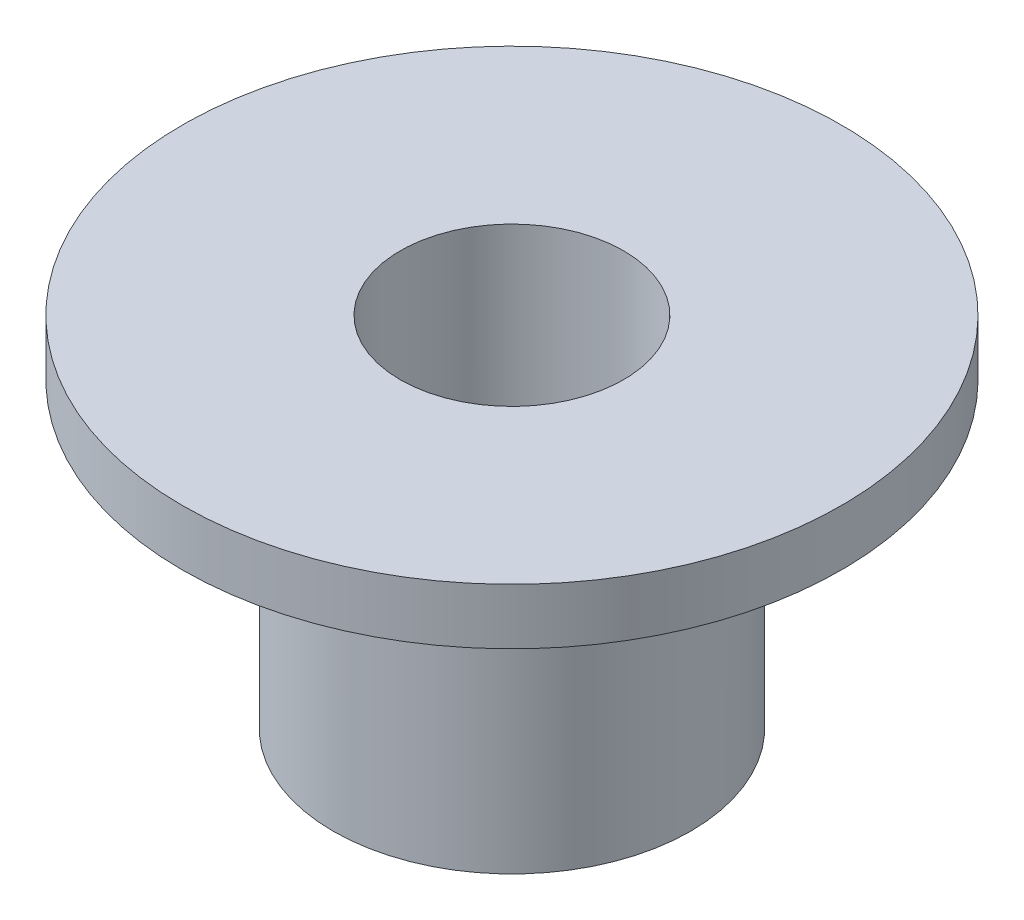
ISO-10303-21;
HEADER;
FILE_DESCRIPTION(('STEP AP214'),'2;1');
FILE_NAME('part.step','',(''),(''),'','','');
FILE_SCHEMA(('AUTOMOTIVE_DESIGN { 1 0 10303 214 1 1 1 1 }'));
ENDSEC;
DATA;
#1=APPLICATION_CONTEXT('core data for automotive mechanical design processes');
#2=APPLICATION_PROTOCOL_DEFINITION('international standard','automotive_design',2000,#1);
#3=PRODUCT_CONTEXT('',#1,'mechanical');
#4=PRODUCT('Part','Part','',(#3));
#5=PRODUCT_RELATED_PRODUCT_CATEGORY('part','',(#4));
#6=PRODUCT_DEFINITION_FORMATION('','',#4);
#7=PRODUCT_DEFINITION_CONTEXT('part definition',#1,'design');
#8=PRODUCT_DEFINITION('design','',#6,#7);
#9=PRODUCT_DEFINITION_SHAPE('','',#8);
#10=(LENGTH_UNIT() NAMED_UNIT(*) SI_UNIT(.MILLI.,.METRE.));
#11=(NAMED_UNIT(*) PLANE_ANGLE_UNIT() SI_UNIT($,.RADIAN.));
#12=(NAMED_UNIT(*) SI_UNIT($,.STERADIAN.) SOLID_ANGLE_UNIT());
#13=UNCERTAINTY_MEASURE_WITH_UNIT(LENGTH_MEASURE(1.E-05),#10,'distance_accuracy_value','');
#14=(GEOMETRIC_REPRESENTATION_CONTEXT(3) GLOBAL_UNCERTAINTY_ASSIGNED_CONTEXT((#13)) GLOBAL_UNIT_ASSIGNED_CONTEXT((#10,
#11,#12)) REPRESENTATION_CONTEXT('',''));
#15=CARTESIAN_POINT('',(0.,0.,0.));
#16=DIRECTION('',(0.,0.,1.));
#17=DIRECTION('',(1.,0.,0.));
#18=AXIS2_PLACEMENT_3D('',#15,#16,#17);
#19=CARTESIAN_POINT('',(0.,0.,0.));
#20=DIRECTION('',(0.,1.,0.));
#21=DIRECTION('',(0.,0.,1.));
#22=AXIS2_PLACEMENT_3D('',#19,#20,#21);
#23=PLANE('',#22);
#24=CARTESIAN_POINT('',(0.,0.,0.));
#25=DIRECTION('',(0.,1.,0.));
#26=DIRECTION('',(0.,0.,1.));
#27=AXIS2_PLACEMENT_3D('',#24,#25,#26);
#28=CIRCLE('',#27,29.5);
#29=CARTESIAN_POINT('',(0.,0.,29.5));
#30=VERTEX_POINT('',#29);
#31=EDGE_CURVE('E42',#30,#30,#28,.T.);
#32=ORIENTED_EDGE('',*,*,#31,.F.);
#33=EDGE_LOOP('',(#32));
#34=FACE_BOUND('',#33,.T.);
#35=CARTESIAN_POINT('',(0.,0.,0.));
#36=DIRECTION('',(0.,1.,0.));
#37=DIRECTION('',(0.,0.,1.));
#38=AXIS2_PLACEMENT_3D('',#35,#36,#37);
#39=CIRCLE('',#38,16.);
#40=CARTESIAN_POINT('',(0.,0.,16.));
#41=VERTEX_POINT('',#40);
#42=EDGE_CURVE('E10',#41,#41,#39,.F.);
#43=ORIENTED_EDGE('',*,*,#42,.F.);
#44=EDGE_LOOP('',(#43));
#45=FACE_BOUND('',#44,.T.);
#46=ADVANCED_FACE('F31',(#34,#45),#23,.F.);
#47=CARTESIAN_POINT('',(0.,5.,0.));
#48=DIRECTION('',(0.,1.,0.));
#49=DIRECTION('',(0.,0.,1.));
#50=AXIS2_PLACEMENT_3D('',#47,#48,#49);
#51=PLANE('',#50);
#52=CARTESIAN_POINT('',(0.,5.,0.));
#53=DIRECTION('',(0.,1.,0.));
#54=DIRECTION('',(0.,0.,1.));
#55=AXIS2_PLACEMENT_3D('',#52,#53,#54);
#56=CIRCLE('',#55,29.5);
#57=CARTESIAN_POINT('',(0.,5.,29.5));
#58=VERTEX_POINT('',#57);
#59=EDGE_CURVE('E38',#58,#58,#56,.T.);
#60=ORIENTED_EDGE('',*,*,#59,.T.);
#61=EDGE_LOOP('',(#60));
#62=FACE_BOUND('',#61,.T.);
#63=CARTESIAN_POINT('',(0.,5.,0.));
#64=DIRECTION('',(0.,1.,0.));
#65=DIRECTION('',(0.,0.,1.));
#66=AXIS2_PLACEMENT_3D('',#63,#64,#65);
#67=CIRCLE('',#66,10.);
#68=CARTESIAN_POINT('',(0.,5.,10.));
#69=VERTEX_POINT('',#68);
#70=EDGE_CURVE('E47',#69,#69,#67,.T.);
#71=ORIENTED_EDGE('',*,*,#70,.F.);
#72=EDGE_LOOP('',(#71));
#73=FACE_BOUND('',#72,.T.);
#74=ADVANCED_FACE('F74',(#62,#73),#51,.T.);
#75=CARTESIAN_POINT('',(0.,5.,0.));
#76=DIRECTION('',(0.,-1.,0.));
#77=DIRECTION('',(0.,0.,-1.));
#78=AXIS2_PLACEMENT_3D('',#75,#76,#77);
#79=CYLINDRICAL_SURFACE('',#78,29.5);
#80=ORIENTED_EDGE('',*,*,#59,.F.);
#81=EDGE_LOOP('',(#80));
#82=FACE_BOUND('',#81,.T.);
#83=ORIENTED_EDGE('',*,*,#31,.T.);
#84=EDGE_LOOP('',(#83));
#85=FACE_BOUND('',#84,.T.);
#86=ADVANCED_FACE('F33',(#82,#85),#79,.T.);
#87=CARTESIAN_POINT('',(0.,5.,0.));
#88=DIRECTION('',(0.,-1.,0.));
#89=DIRECTION('',(0.,0.,-1.));
#90=AXIS2_PLACEMENT_3D('',#87,#88,#89);
#91=CYLINDRICAL_SURFACE('',#90,10.);
#92=ORIENTED_EDGE('',*,*,#70,.T.);
#93=EDGE_LOOP('',(#92));
#94=FACE_BOUND('',#93,.T.);
#95=CARTESIAN_POINT('',(0.,-27.,0.));
#96=DIRECTION('',(0.,-1.,0.));
#97=DIRECTION('',(0.,0.,-1.));
#98=AXIS2_PLACEMENT_3D('',#95,#96,#97);
#99=CIRCLE('',#98,10.);
#100=CARTESIAN_POINT('',(0.,-27.,-10.));
#101=VERTEX_POINT('',#100);
#102=EDGE_CURVE('E54',#101,#101,#99,.T.);
#103=ORIENTED_EDGE('',*,*,#102,.T.);
#104=EDGE_LOOP('',(#103));
#105=FACE_BOUND('',#104,.T.);
#106=ADVANCED_FACE('F58',(#94,#105),#91,.F.);
#107=CARTESIAN_POINT('',(0.,-27.,0.));
#108=DIRECTION('',(0.,-1.,0.));
#109=DIRECTION('',(0.,0.,-1.));
#110=AXIS2_PLACEMENT_3D('',#107,#108,#109);
#111=PLANE('',#110);
#112=CARTESIAN_POINT('',(0.,-27.,0.));
#113=DIRECTION('',(0.,-1.,0.));
#114=DIRECTION('',(0.,0.,-1.));
#115=AXIS2_PLACEMENT_3D('',#112,#113,#114);
#116=CIRCLE('',#115,16.);
#117=CARTESIAN_POINT('',(0.,-27.,-16.));
#118=VERTEX_POINT('',#117);
#119=EDGE_CURVE('E51',#118,#118,#116,.T.);
#120=ORIENTED_EDGE('',*,*,#119,.T.);
#121=EDGE_LOOP('',(#120));
#122=FACE_BOUND('',#121,.T.);
#123=ORIENTED_EDGE('',*,*,#102,.F.);
#124=EDGE_LOOP('',(#123));
#125=FACE_BOUND('',#124,.T.);
#126=ADVANCED_FACE('F60',(#122,#125),#111,.T.);
#127=CARTESIAN_POINT('',(0.,-27.,0.));
#128=DIRECTION('',(0.,1.,0.));
#129=DIRECTION('',(0.,0.,1.));
#130=AXIS2_PLACEMENT_3D('',#127,#128,#129);
#131=CYLINDRICAL_SURFACE('',#130,16.);
#132=ORIENTED_EDGE('',*,*,#119,.F.);
#133=EDGE_LOOP('',(#132));
#134=FACE_BOUND('',#133,.T.);
#135=ORIENTED_EDGE('',*,*,#42,.T.);
#136=EDGE_LOOP('',(#135));
#137=FACE_BOUND('',#136,.T.);
#138=ADVANCED_FACE('F62',(#134,#137),#131,.T.);
#139=CLOSED_SHELL('',(#46,#74,#86,#106,#126,#138));
#140=MANIFOLD_SOLID_BREP('B2',#139);
#141=ADVANCED_BREP_SHAPE_REPRESENTATION('',(#18,#140),#14);
#142=SHAPE_DEFINITION_REPRESENTATION(#9,#141);
ENDSEC;
END-ISO-10303-21;
